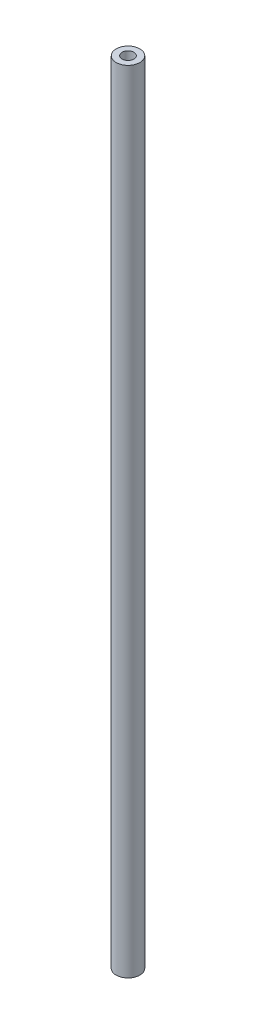
ISO-10303-21;
HEADER;
FILE_DESCRIPTION(('STEP AP214'),'2;1');
FILE_NAME('part.step','',(''),(''),'','','');
FILE_SCHEMA(('AUTOMOTIVE_DESIGN { 1 0 10303 214 1 1 1 1 }'));
ENDSEC;
DATA;
#1=APPLICATION_CONTEXT('core data for automotive mechanical design processes');
#2=APPLICATION_PROTOCOL_DEFINITION('international standard','automotive_design',2000,#1);
#3=PRODUCT_CONTEXT('',#1,'mechanical');
#4=PRODUCT('Part','Part','',(#3));
#5=PRODUCT_RELATED_PRODUCT_CATEGORY('part','',(#4));
#6=PRODUCT_DEFINITION_FORMATION('','',#4);
#7=PRODUCT_DEFINITION_CONTEXT('part definition',#1,'design');
#8=PRODUCT_DEFINITION('design','',#6,#7);
#9=PRODUCT_DEFINITION_SHAPE('','',#8);
#10=(LENGTH_UNIT() NAMED_UNIT(*) SI_UNIT(.MILLI.,.METRE.));
#11=(NAMED_UNIT(*) PLANE_ANGLE_UNIT() SI_UNIT($,.RADIAN.));
#12=(NAMED_UNIT(*) SI_UNIT($,.STERADIAN.) SOLID_ANGLE_UNIT());
#13=UNCERTAINTY_MEASURE_WITH_UNIT(LENGTH_MEASURE(1.E-05),#10,'distance_accuracy_value','');
#14=(GEOMETRIC_REPRESENTATION_CONTEXT(3) GLOBAL_UNCERTAINTY_ASSIGNED_CONTEXT((#13)) GLOBAL_UNIT_ASSIGNED_CONTEXT((#10,
#11,#12)) REPRESENTATION_CONTEXT('',''));
#15=CARTESIAN_POINT('',(0.,0.,0.));
#16=DIRECTION('',(0.,0.,1.));
#17=DIRECTION('',(1.,0.,0.));
#18=AXIS2_PLACEMENT_3D('',#15,#16,#17);
#19=CARTESIAN_POINT('',(0.,200.,0.));
#20=DIRECTION('',(0.,1.,0.));
#21=DIRECTION('',(0.,0.,1.));
#22=AXIS2_PLACEMENT_3D('',#19,#20,#21);
#23=PLANE('',#22);
#24=CARTESIAN_POINT('',(0.,200.,0.));
#25=DIRECTION('',(0.,1.,0.));
#26=DIRECTION('',(0.,0.,1.));
#27=AXIS2_PLACEMENT_3D('',#24,#25,#26);
#28=CIRCLE('',#27,3.);
#29=CARTESIAN_POINT('',(0.,200.,3.));
#30=VERTEX_POINT('',#29);
#31=EDGE_CURVE('E10',#30,#30,#28,.T.);
#32=ORIENTED_EDGE('',*,*,#31,.T.);
#33=EDGE_LOOP('',(#32));
#34=FACE_BOUND('',#33,.T.);
#35=CARTESIAN_POINT('',(0.,200.,0.));
#36=DIRECTION('',(0.,1.,0.));
#37=DIRECTION('',(0.,0.,1.));
#38=AXIS2_PLACEMENT_3D('',#35,#36,#37);
#39=CIRCLE('',#38,1.5);
#40=CARTESIAN_POINT('',(0.,200.,1.5));
#41=VERTEX_POINT('',#40);
#42=EDGE_CURVE('E50',#41,#41,#39,.T.);
#43=ORIENTED_EDGE('',*,*,#42,.F.);
#44=EDGE_LOOP('',(#43));
#45=FACE_BOUND('',#44,.T.);
#46=ADVANCED_FACE('F37',(#34,#45),#23,.T.);
#47=CARTESIAN_POINT('',(0.,0.,0.));
#48=DIRECTION('',(0.,1.,0.));
#49=DIRECTION('',(0.,0.,1.));
#50=AXIS2_PLACEMENT_3D('',#47,#48,#49);
#51=PLANE('',#50);
#52=CARTESIAN_POINT('',(0.,0.,0.));
#53=DIRECTION('',(0.,1.,0.));
#54=DIRECTION('',(0.,0.,1.));
#55=AXIS2_PLACEMENT_3D('',#52,#53,#54);
#56=CIRCLE('',#55,3.);
#57=CARTESIAN_POINT('',(0.,0.,3.));
#58=VERTEX_POINT('',#57);
#59=EDGE_CURVE('E41',#58,#58,#56,.T.);
#60=ORIENTED_EDGE('',*,*,#59,.F.);
#61=EDGE_LOOP('',(#60));
#62=FACE_BOUND('',#61,.T.);
#63=CARTESIAN_POINT('',(0.,0.,0.));
#64=DIRECTION('',(0.,1.,0.));
#65=DIRECTION('',(0.,0.,1.));
#66=AXIS2_PLACEMENT_3D('',#63,#64,#65);
#67=CIRCLE('',#66,1.5);
#68=CARTESIAN_POINT('',(0.,0.,1.5));
#69=VERTEX_POINT('',#68);
#70=EDGE_CURVE('E52',#69,#69,#67,.T.);
#71=ORIENTED_EDGE('',*,*,#70,.T.);
#72=EDGE_LOOP('',(#71));
#73=FACE_BOUND('',#72,.T.);
#74=ADVANCED_FACE('F64',(#62,#73),#51,.F.);
#75=CARTESIAN_POINT('',(0.,200.,0.));
#76=DIRECTION('',(0.,-1.,0.));
#77=DIRECTION('',(0.,0.,-1.));
#78=AXIS2_PLACEMENT_3D('',#75,#76,#77);
#79=CYLINDRICAL_SURFACE('',#78,3.);
#80=ORIENTED_EDGE('',*,*,#31,.F.);
#81=EDGE_LOOP('',(#80));
#82=FACE_BOUND('',#81,.T.);
#83=ORIENTED_EDGE('',*,*,#59,.T.);
#84=EDGE_LOOP('',(#83));
#85=FACE_BOUND('',#84,.T.);
#86=ADVANCED_FACE('F39',(#82,#85),#79,.T.);
#87=CARTESIAN_POINT('',(0.,200.,0.));
#88=DIRECTION('',(0.,-1.,0.));
#89=DIRECTION('',(0.,0.,-1.));
#90=AXIS2_PLACEMENT_3D('',#87,#88,#89);
#91=CYLINDRICAL_SURFACE('',#90,1.5);
#92=ORIENTED_EDGE('',*,*,#42,.T.);
#93=EDGE_LOOP('',(#92));
#94=FACE_BOUND('',#93,.T.);
#95=ORIENTED_EDGE('',*,*,#70,.F.);
#96=EDGE_LOOP('',(#95));
#97=FACE_BOUND('',#96,.T.);
#98=ADVANCED_FACE('F60',(#94,#97),#91,.F.);
#99=CLOSED_SHELL('',(#46,#74,#86,#98));
#100=MANIFOLD_SOLID_BREP('B2',#99);
#101=ADVANCED_BREP_SHAPE_REPRESENTATION('',(#18,#100),#14);
#102=SHAPE_DEFINITION_REPRESENTATION(#9,#101);
ENDSEC;
END-ISO-10303-21;
